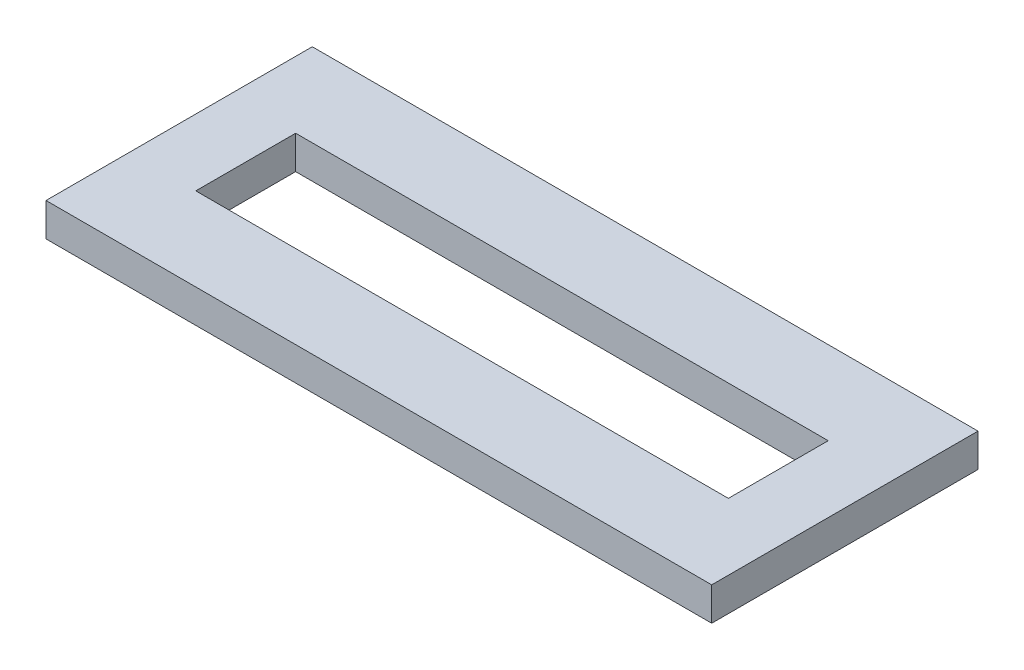
ISO-10303-21;
HEADER;
FILE_DESCRIPTION(('STEP AP214'),'2;1');
FILE_NAME('part.step','',(''),(''),'','','');
FILE_SCHEMA(('AUTOMOTIVE_DESIGN { 1 0 10303 214 1 1 1 1 }'));
ENDSEC;
DATA;
#1=APPLICATION_CONTEXT('core data for automotive mechanical design processes');
#2=APPLICATION_PROTOCOL_DEFINITION('international standard','automotive_design',2000,#1);
#3=PRODUCT_CONTEXT('',#1,'mechanical');
#4=PRODUCT('Part','Part','',(#3));
#5=PRODUCT_RELATED_PRODUCT_CATEGORY('part','',(#4));
#6=PRODUCT_DEFINITION_FORMATION('','',#4);
#7=PRODUCT_DEFINITION_CONTEXT('part definition',#1,'design');
#8=PRODUCT_DEFINITION('design','',#6,#7);
#9=PRODUCT_DEFINITION_SHAPE('','',#8);
#10=(LENGTH_UNIT() NAMED_UNIT(*) SI_UNIT(.MILLI.,.METRE.));
#11=(NAMED_UNIT(*) PLANE_ANGLE_UNIT() SI_UNIT($,.RADIAN.));
#12=(NAMED_UNIT(*) SI_UNIT($,.STERADIAN.) SOLID_ANGLE_UNIT());
#13=UNCERTAINTY_MEASURE_WITH_UNIT(LENGTH_MEASURE(1.E-05),#10,'distance_accuracy_value','');
#14=(GEOMETRIC_REPRESENTATION_CONTEXT(3) GLOBAL_UNCERTAINTY_ASSIGNED_CONTEXT((#13)) GLOBAL_UNIT_ASSIGNED_CONTEXT((#10,
#11,#12)) REPRESENTATION_CONTEXT('',''));
#15=CARTESIAN_POINT('',(0.,0.,0.));
#16=DIRECTION('',(0.,0.,1.));
#17=DIRECTION('',(1.,0.,0.));
#18=AXIS2_PLACEMENT_3D('',#15,#16,#17);
#19=CARTESIAN_POINT('',(0.,3.175,0.));
#20=DIRECTION('',(0.,1.,0.));
#21=DIRECTION('',(0.,0.,1.));
#22=AXIS2_PLACEMENT_3D('',#19,#20,#21);
#23=PLANE('',#22);
#24=DIRECTION('',(0.,0.,-1.));
#25=VECTOR('',#24,1.);
#26=CARTESIAN_POINT('',(31.75,3.175,-12.7));
#27=LINE('',#26,#25);
#28=CARTESIAN_POINT('',(31.75,3.175,12.7));
#29=VERTEX_POINT('',#28);
#30=CARTESIAN_POINT('',(31.75,3.175,-12.7));
#31=VERTEX_POINT('',#30);
#32=EDGE_CURVE('E135',#29,#31,#27,.T.);
#33=ORIENTED_EDGE('',*,*,#32,.T.);
#34=DIRECTION('',(-1.,0.,0.));
#35=VECTOR('',#34,1.);
#36=CARTESIAN_POINT('',(-31.75,3.175,-12.7));
#37=LINE('',#36,#35);
#38=CARTESIAN_POINT('',(-31.75,3.175,-12.7));
#39=VERTEX_POINT('',#38);
#40=EDGE_CURVE('E138',#31,#39,#37,.T.);
#41=ORIENTED_EDGE('',*,*,#40,.T.);
#42=DIRECTION('',(0.,0.,1.));
#43=VECTOR('',#42,1.);
#44=CARTESIAN_POINT('',(-31.75,3.175,-12.7));
#45=LINE('',#44,#43);
#46=CARTESIAN_POINT('',(-31.75,3.175,12.7));
#47=VERTEX_POINT('',#46);
#48=EDGE_CURVE('E141',#39,#47,#45,.T.);
#49=ORIENTED_EDGE('',*,*,#48,.T.);
#50=DIRECTION('',(1.,0.,0.));
#51=VECTOR('',#50,1.);
#52=CARTESIAN_POINT('',(-31.75,3.175,12.7));
#53=LINE('',#52,#51);
#54=EDGE_CURVE('E143',#47,#29,#53,.T.);
#55=ORIENTED_EDGE('',*,*,#54,.T.);
#56=EDGE_LOOP('',(#33,#41,#49,#55));
#57=FACE_BOUND('',#56,.T.);
#58=DIRECTION('',(0.,0.,1.));
#59=VECTOR('',#58,1.);
#60=CARTESIAN_POINT('',(-25.4,3.175,-4.76250000000001));
#61=LINE('',#60,#59);
#62=CARTESIAN_POINT('',(-25.4,3.175,-4.76250000000001));
#63=VERTEX_POINT('',#62);
#64=CARTESIAN_POINT('',(-25.4,3.175,4.76249999999999));
#65=VERTEX_POINT('',#64);
#66=EDGE_CURVE('E107',#63,#65,#61,.T.);
#67=ORIENTED_EDGE('',*,*,#66,.F.);
#68=DIRECTION('',(-1.,0.,0.));
#69=VECTOR('',#68,1.);
#70=CARTESIAN_POINT('',(-25.4,3.175,-4.76250000000001));
#71=LINE('',#70,#69);
#72=CARTESIAN_POINT('',(25.4,3.175,-4.76250000000001));
#73=VERTEX_POINT('',#72);
#74=EDGE_CURVE('E99',#73,#63,#71,.T.);
#75=ORIENTED_EDGE('',*,*,#74,.F.);
#76=DIRECTION('',(0.,0.,-1.));
#77=VECTOR('',#76,1.);
#78=CARTESIAN_POINT('',(25.4,3.175,-4.76250000000001));
#79=LINE('',#78,#77);
#80=CARTESIAN_POINT('',(25.4,3.175,4.76249999999999));
#81=VERTEX_POINT('',#80);
#82=EDGE_CURVE('E121',#81,#73,#79,.T.);
#83=ORIENTED_EDGE('',*,*,#82,.F.);
#84=DIRECTION('',(1.,0.,0.));
#85=VECTOR('',#84,1.);
#86=CARTESIAN_POINT('',(25.4,3.175,4.76249999999999));
#87=LINE('',#86,#85);
#88=EDGE_CURVE('E119',#65,#81,#87,.T.);
#89=ORIENTED_EDGE('',*,*,#88,.F.);
#90=EDGE_LOOP('',(#67,#75,#83,#89));
#91=FACE_BOUND('',#90,.T.);
#92=ADVANCED_FACE('F34',(#57,#91),#23,.T.);
#93=CARTESIAN_POINT('',(0.,0.,0.));
#94=DIRECTION('',(0.,1.,0.));
#95=DIRECTION('',(0.,0.,1.));
#96=AXIS2_PLACEMENT_3D('',#93,#94,#95);
#97=PLANE('',#96);
#98=DIRECTION('',(0.,0.,-1.));
#99=VECTOR('',#98,1.);
#100=CARTESIAN_POINT('',(31.75,0.,-12.7));
#101=LINE('',#100,#99);
#102=CARTESIAN_POINT('',(31.75,0.,12.7));
#103=VERTEX_POINT('',#102);
#104=CARTESIAN_POINT('',(31.75,0.,-12.7));
#105=VERTEX_POINT('',#104);
#106=EDGE_CURVE('E115',#103,#105,#101,.T.);
#107=ORIENTED_EDGE('',*,*,#106,.F.);
#108=DIRECTION('',(1.,0.,0.));
#109=VECTOR('',#108,1.);
#110=CARTESIAN_POINT('',(-31.75,0.,12.7));
#111=LINE('',#110,#109);
#112=CARTESIAN_POINT('',(-31.75,0.,12.7));
#113=VERTEX_POINT('',#112);
#114=EDGE_CURVE('E139',#113,#103,#111,.T.);
#115=ORIENTED_EDGE('',*,*,#114,.F.);
#116=DIRECTION('',(0.,0.,1.));
#117=VECTOR('',#116,1.);
#118=CARTESIAN_POINT('',(-31.75,0.,-12.7));
#119=LINE('',#118,#117);
#120=CARTESIAN_POINT('',(-31.75,0.,-12.7));
#121=VERTEX_POINT('',#120);
#122=EDGE_CURVE('E150',#121,#113,#119,.T.);
#123=ORIENTED_EDGE('',*,*,#122,.F.);
#124=DIRECTION('',(-1.,0.,0.));
#125=VECTOR('',#124,1.);
#126=CARTESIAN_POINT('',(-31.75,0.,-12.7));
#127=LINE('',#126,#125);
#128=EDGE_CURVE('E148',#105,#121,#127,.T.);
#129=ORIENTED_EDGE('',*,*,#128,.F.);
#130=EDGE_LOOP('',(#107,#115,#123,#129));
#131=FACE_BOUND('',#130,.T.);
#132=DIRECTION('',(-1.,0.,0.));
#133=VECTOR('',#132,1.);
#134=CARTESIAN_POINT('',(-25.4,0.,-4.76250000000001));
#135=LINE('',#134,#133);
#136=CARTESIAN_POINT('',(25.4,0.,-4.76250000000001));
#137=VERTEX_POINT('',#136);
#138=CARTESIAN_POINT('',(-25.4,0.,-4.76250000000001));
#139=VERTEX_POINT('',#138);
#140=EDGE_CURVE('E57',#137,#139,#135,.T.);
#141=ORIENTED_EDGE('',*,*,#140,.T.);
#142=DIRECTION('',(0.,0.,1.));
#143=VECTOR('',#142,1.);
#144=CARTESIAN_POINT('',(-25.4,0.,-4.76250000000001));
#145=LINE('',#144,#143);
#146=CARTESIAN_POINT('',(-25.4,0.,4.76249999999999));
#147=VERTEX_POINT('',#146);
#148=EDGE_CURVE('E114',#139,#147,#145,.T.);
#149=ORIENTED_EDGE('',*,*,#148,.T.);
#150=DIRECTION('',(1.,0.,0.));
#151=VECTOR('',#150,1.);
#152=CARTESIAN_POINT('',(25.4,0.,4.76249999999999));
#153=LINE('',#152,#151);
#154=CARTESIAN_POINT('',(25.4,0.,4.76249999999999));
#155=VERTEX_POINT('',#154);
#156=EDGE_CURVE('E127',#147,#155,#153,.T.);
#157=ORIENTED_EDGE('',*,*,#156,.T.);
#158=DIRECTION('',(0.,0.,-1.));
#159=VECTOR('',#158,1.);
#160=CARTESIAN_POINT('',(25.4,0.,-4.76250000000001));
#161=LINE('',#160,#159);
#162=EDGE_CURVE('E108',#155,#137,#161,.T.);
#163=ORIENTED_EDGE('',*,*,#162,.T.);
#164=EDGE_LOOP('',(#141,#149,#157,#163));
#165=FACE_BOUND('',#164,.T.);
#166=ADVANCED_FACE('F168',(#131,#165),#97,.F.);
#167=CARTESIAN_POINT('',(31.75,3.175,-12.7));
#168=DIRECTION('',(-1.,0.,0.));
#169=DIRECTION('',(0.,0.,1.));
#170=AXIS2_PLACEMENT_3D('',#167,#168,#169);
#171=PLANE('',#170);
#172=ORIENTED_EDGE('',*,*,#106,.T.);
#173=DIRECTION('',(0.,-1.,0.));
#174=VECTOR('',#173,1.);
#175=CARTESIAN_POINT('',(31.75,3.175,-12.7));
#176=LINE('',#175,#174);
#177=EDGE_CURVE('E11',#31,#105,#176,.T.);
#178=ORIENTED_EDGE('',*,*,#177,.F.);
#179=ORIENTED_EDGE('',*,*,#32,.F.);
#180=DIRECTION('',(0.,-1.,0.));
#181=VECTOR('',#180,1.);
#182=CARTESIAN_POINT('',(31.75,3.175,12.7));
#183=LINE('',#182,#181);
#184=EDGE_CURVE('E145',#29,#103,#183,.T.);
#185=ORIENTED_EDGE('',*,*,#184,.T.);
#186=EDGE_LOOP('',(#172,#178,#179,#185));
#187=FACE_BOUND('',#186,.T.);
#188=ADVANCED_FACE('F36',(#187),#171,.F.);
#189=CARTESIAN_POINT('',(-31.75,3.175,-12.7));
#190=DIRECTION('',(0.,0.,1.));
#191=DIRECTION('',(1.,0.,0.));
#192=AXIS2_PLACEMENT_3D('',#189,#190,#191);
#193=PLANE('',#192);
#194=ORIENTED_EDGE('',*,*,#128,.T.);
#195=DIRECTION('',(0.,-1.,0.));
#196=VECTOR('',#195,1.);
#197=CARTESIAN_POINT('',(-31.75,3.175,-12.7));
#198=LINE('',#197,#196);
#199=EDGE_CURVE('E42',#39,#121,#198,.T.);
#200=ORIENTED_EDGE('',*,*,#199,.F.);
#201=ORIENTED_EDGE('',*,*,#40,.F.);
#202=ORIENTED_EDGE('',*,*,#177,.T.);
#203=EDGE_LOOP('',(#194,#200,#201,#202));
#204=FACE_BOUND('',#203,.T.);
#205=ADVANCED_FACE('F178',(#204),#193,.F.);
#206=CARTESIAN_POINT('',(-31.75,3.175,-12.7));
#207=DIRECTION('',(1.,0.,0.));
#208=DIRECTION('',(0.,0.,-1.));
#209=AXIS2_PLACEMENT_3D('',#206,#207,#208);
#210=PLANE('',#209);
#211=ORIENTED_EDGE('',*,*,#122,.T.);
#212=DIRECTION('',(0.,-1.,0.));
#213=VECTOR('',#212,1.);
#214=CARTESIAN_POINT('',(-31.75,3.175,12.7));
#215=LINE('',#214,#213);
#216=EDGE_CURVE('E155',#47,#113,#215,.T.);
#217=ORIENTED_EDGE('',*,*,#216,.F.);
#218=ORIENTED_EDGE('',*,*,#48,.F.);
#219=ORIENTED_EDGE('',*,*,#199,.T.);
#220=EDGE_LOOP('',(#211,#217,#218,#219));
#221=FACE_BOUND('',#220,.T.);
#222=ADVANCED_FACE('F162',(#221),#210,.F.);
#223=CARTESIAN_POINT('',(-31.75,3.175,12.7));
#224=DIRECTION('',(0.,0.,-1.));
#225=DIRECTION('',(-1.,0.,0.));
#226=AXIS2_PLACEMENT_3D('',#223,#224,#225);
#227=PLANE('',#226);
#228=ORIENTED_EDGE('',*,*,#114,.T.);
#229=ORIENTED_EDGE('',*,*,#184,.F.);
#230=ORIENTED_EDGE('',*,*,#54,.F.);
#231=ORIENTED_EDGE('',*,*,#216,.T.);
#232=EDGE_LOOP('',(#228,#229,#230,#231));
#233=FACE_BOUND('',#232,.T.);
#234=ADVANCED_FACE('F172',(#233),#227,.F.);
#235=CARTESIAN_POINT('',(-25.4,3.175,-4.76250000000001));
#236=DIRECTION('',(0.,0.,1.));
#237=DIRECTION('',(1.,0.,0.));
#238=AXIS2_PLACEMENT_3D('',#235,#236,#237);
#239=PLANE('',#238);
#240=ORIENTED_EDGE('',*,*,#140,.F.);
#241=DIRECTION('',(0.,-1.,0.));
#242=VECTOR('',#241,1.);
#243=CARTESIAN_POINT('',(25.4,3.175,-4.76250000000001));
#244=LINE('',#243,#242);
#245=EDGE_CURVE('E103',#73,#137,#244,.T.);
#246=ORIENTED_EDGE('',*,*,#245,.F.);
#247=ORIENTED_EDGE('',*,*,#74,.T.);
#248=DIRECTION('',(0.,-1.,0.));
#249=VECTOR('',#248,1.);
#250=CARTESIAN_POINT('',(-25.4,3.175,-4.76250000000001));
#251=LINE('',#250,#249);
#252=EDGE_CURVE('E102',#63,#139,#251,.T.);
#253=ORIENTED_EDGE('',*,*,#252,.T.);
#254=EDGE_LOOP('',(#240,#246,#247,#253));
#255=FACE_BOUND('',#254,.T.);
#256=ADVANCED_FACE('F101',(#255),#239,.T.);
#257=CARTESIAN_POINT('',(-25.4,3.175,-4.76250000000001));
#258=DIRECTION('',(1.,0.,0.));
#259=DIRECTION('',(0.,0.,-1.));
#260=AXIS2_PLACEMENT_3D('',#257,#258,#259);
#261=PLANE('',#260);
#262=ORIENTED_EDGE('',*,*,#148,.F.);
#263=ORIENTED_EDGE('',*,*,#252,.F.);
#264=ORIENTED_EDGE('',*,*,#66,.T.);
#265=DIRECTION('',(0.,-1.,0.));
#266=VECTOR('',#265,1.);
#267=CARTESIAN_POINT('',(-25.4,3.175,4.76249999999999));
#268=LINE('',#267,#266);
#269=EDGE_CURVE('E116',#65,#147,#268,.T.);
#270=ORIENTED_EDGE('',*,*,#269,.T.);
#271=EDGE_LOOP('',(#262,#263,#264,#270));
#272=FACE_BOUND('',#271,.T.);
#273=ADVANCED_FACE('F111',(#272),#261,.T.);
#274=CARTESIAN_POINT('',(25.4,3.175,4.76249999999999));
#275=DIRECTION('',(0.,0.,-1.));
#276=DIRECTION('',(-1.,0.,0.));
#277=AXIS2_PLACEMENT_3D('',#274,#275,#276);
#278=PLANE('',#277);
#279=ORIENTED_EDGE('',*,*,#156,.F.);
#280=ORIENTED_EDGE('',*,*,#269,.F.);
#281=ORIENTED_EDGE('',*,*,#88,.T.);
#282=DIRECTION('',(0.,-1.,0.));
#283=VECTOR('',#282,1.);
#284=CARTESIAN_POINT('',(25.4,3.175,4.76249999999999));
#285=LINE('',#284,#283);
#286=EDGE_CURVE('E49',#81,#155,#285,.T.);
#287=ORIENTED_EDGE('',*,*,#286,.T.);
#288=EDGE_LOOP('',(#279,#280,#281,#287));
#289=FACE_BOUND('',#288,.T.);
#290=ADVANCED_FACE('F201',(#289),#278,.T.);
#291=CARTESIAN_POINT('',(25.4,3.175,-4.76250000000001));
#292=DIRECTION('',(-1.,0.,0.));
#293=DIRECTION('',(0.,0.,1.));
#294=AXIS2_PLACEMENT_3D('',#291,#292,#293);
#295=PLANE('',#294);
#296=ORIENTED_EDGE('',*,*,#162,.F.);
#297=ORIENTED_EDGE('',*,*,#286,.F.);
#298=ORIENTED_EDGE('',*,*,#82,.T.);
#299=ORIENTED_EDGE('',*,*,#245,.T.);
#300=EDGE_LOOP('',(#296,#297,#298,#299));
#301=FACE_BOUND('',#300,.T.);
#302=ADVANCED_FACE('F205',(#301),#295,.T.);
#303=CLOSED_SHELL('',(#92,#166,#188,#205,#222,#234,#256,#273,#290,#302));
#304=MANIFOLD_SOLID_BREP('B2',#303);
#305=ADVANCED_BREP_SHAPE_REPRESENTATION('',(#18,#304),#14);
#306=SHAPE_DEFINITION_REPRESENTATION(#9,#305);
ENDSEC;
END-ISO-10303-21;
